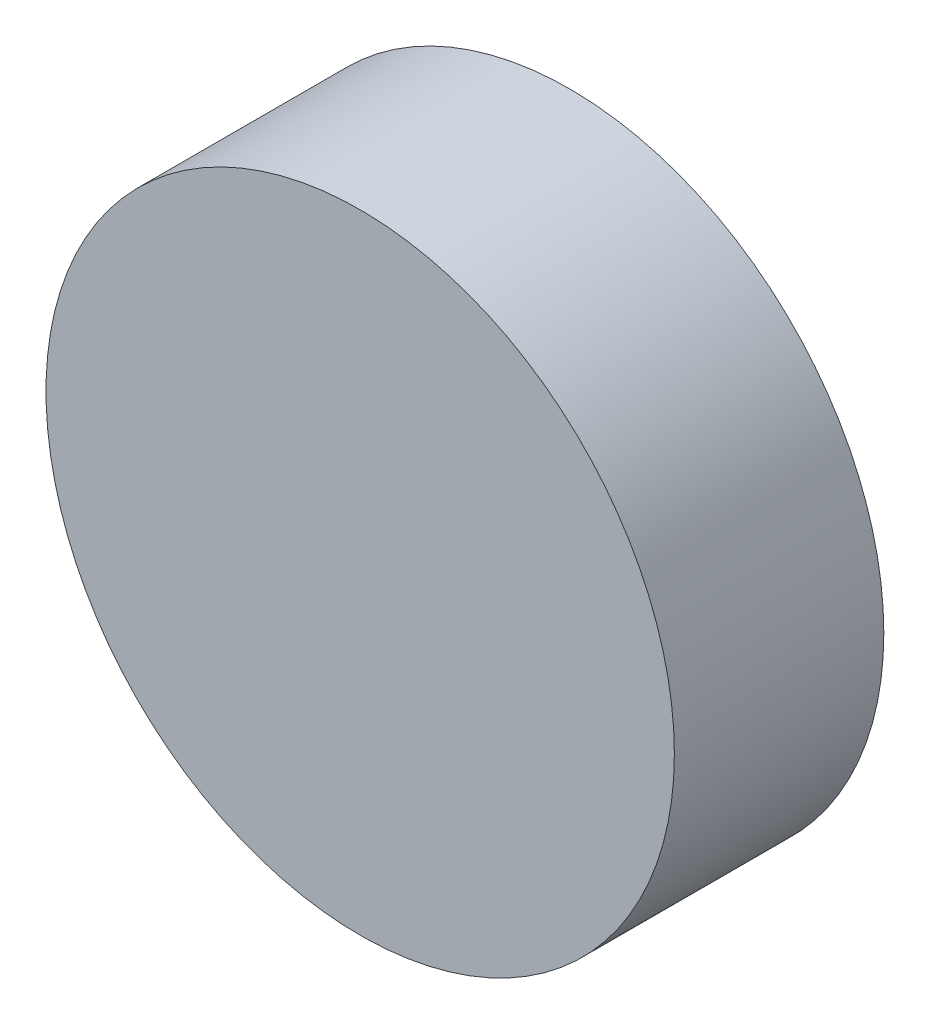
ISO-10303-21;
HEADER;
FILE_DESCRIPTION(('STEP AP214'),'2;1');
FILE_NAME('part.step','',(''),(''),'','','');
FILE_SCHEMA(('AUTOMOTIVE_DESIGN { 1 0 10303 214 1 1 1 1 }'));
ENDSEC;
DATA;
#1=APPLICATION_CONTEXT('core data for automotive mechanical design processes');
#2=APPLICATION_PROTOCOL_DEFINITION('international standard','automotive_design',2000,#1);
#3=PRODUCT_CONTEXT('',#1,'mechanical');
#4=PRODUCT('Part','Part','',(#3));
#5=PRODUCT_RELATED_PRODUCT_CATEGORY('part','',(#4));
#6=PRODUCT_DEFINITION_FORMATION('','',#4);
#7=PRODUCT_DEFINITION_CONTEXT('part definition',#1,'design');
#8=PRODUCT_DEFINITION('design','',#6,#7);
#9=PRODUCT_DEFINITION_SHAPE('','',#8);
#10=(LENGTH_UNIT() NAMED_UNIT(*) SI_UNIT(.MILLI.,.METRE.));
#11=(NAMED_UNIT(*) PLANE_ANGLE_UNIT() SI_UNIT($,.RADIAN.));
#12=(NAMED_UNIT(*) SI_UNIT($,.STERADIAN.) SOLID_ANGLE_UNIT());
#13=UNCERTAINTY_MEASURE_WITH_UNIT(LENGTH_MEASURE(1.E-05),#10,'distance_accuracy_value','');
#14=(GEOMETRIC_REPRESENTATION_CONTEXT(3) GLOBAL_UNCERTAINTY_ASSIGNED_CONTEXT((#13)) GLOBAL_UNIT_ASSIGNED_CONTEXT((#10,
#11,#12)) REPRESENTATION_CONTEXT('',''));
#15=CARTESIAN_POINT('',(0.,0.,0.));
#16=DIRECTION('',(0.,0.,1.));
#17=DIRECTION('',(1.,0.,0.));
#18=AXIS2_PLACEMENT_3D('',#15,#16,#17);
#19=CARTESIAN_POINT('',(0.,0.,1.));
#20=DIRECTION('',(0.,0.,-1.));
#21=DIRECTION('',(-1.,0.,0.));
#22=AXIS2_PLACEMENT_3D('',#19,#20,#21);
#23=CYLINDRICAL_SURFACE('',#22,1.5);
#24=CARTESIAN_POINT('',(0.,0.,1.));
#25=DIRECTION('',(0.,0.,1.));
#26=DIRECTION('',(1.,0.,0.));
#27=AXIS2_PLACEMENT_3D('',#24,#25,#26);
#28=CIRCLE('',#27,1.5);
#29=CARTESIAN_POINT('',(1.5,0.,1.));
#30=VERTEX_POINT('',#29);
#31=EDGE_CURVE('E10',#30,#30,#28,.T.);
#32=ORIENTED_EDGE('',*,*,#31,.F.);
#33=EDGE_LOOP('',(#32));
#34=FACE_BOUND('',#33,.T.);
#35=CARTESIAN_POINT('',(0.,0.,0.));
#36=DIRECTION('',(0.,0.,1.));
#37=DIRECTION('',(1.,0.,0.));
#38=AXIS2_PLACEMENT_3D('',#35,#36,#37);
#39=CIRCLE('',#38,1.5);
#40=CARTESIAN_POINT('',(1.5,0.,0.));
#41=VERTEX_POINT('',#40);
#42=EDGE_CURVE('E33',#41,#41,#39,.T.);
#43=ORIENTED_EDGE('',*,*,#42,.T.);
#44=EDGE_LOOP('',(#43));
#45=FACE_BOUND('',#44,.T.);
#46=ADVANCED_FACE('F30',(#34,#45),#23,.T.);
#47=CARTESIAN_POINT('',(0.,0.,1.));
#48=DIRECTION('',(0.,0.,1.));
#49=DIRECTION('',(1.,0.,0.));
#50=AXIS2_PLACEMENT_3D('',#47,#48,#49);
#51=PLANE('',#50);
#52=ORIENTED_EDGE('',*,*,#31,.T.);
#53=EDGE_LOOP('',(#52));
#54=FACE_BOUND('',#53,.T.);
#55=ADVANCED_FACE('F45',(#54),#51,.T.);
#56=CARTESIAN_POINT('',(0.,0.,0.));
#57=DIRECTION('',(0.,0.,1.));
#58=DIRECTION('',(1.,0.,0.));
#59=AXIS2_PLACEMENT_3D('',#56,#57,#58);
#60=PLANE('',#59);
#61=ORIENTED_EDGE('',*,*,#42,.F.);
#62=EDGE_LOOP('',(#61));
#63=FACE_BOUND('',#62,.T.);
#64=ADVANCED_FACE('F43',(#63),#60,.F.);
#65=CLOSED_SHELL('',(#46,#55,#64));
#66=MANIFOLD_SOLID_BREP('B2',#65);
#67=ADVANCED_BREP_SHAPE_REPRESENTATION('',(#18,#66),#14);
#68=SHAPE_DEFINITION_REPRESENTATION(#9,#67);
ENDSEC;
END-ISO-10303-21;
